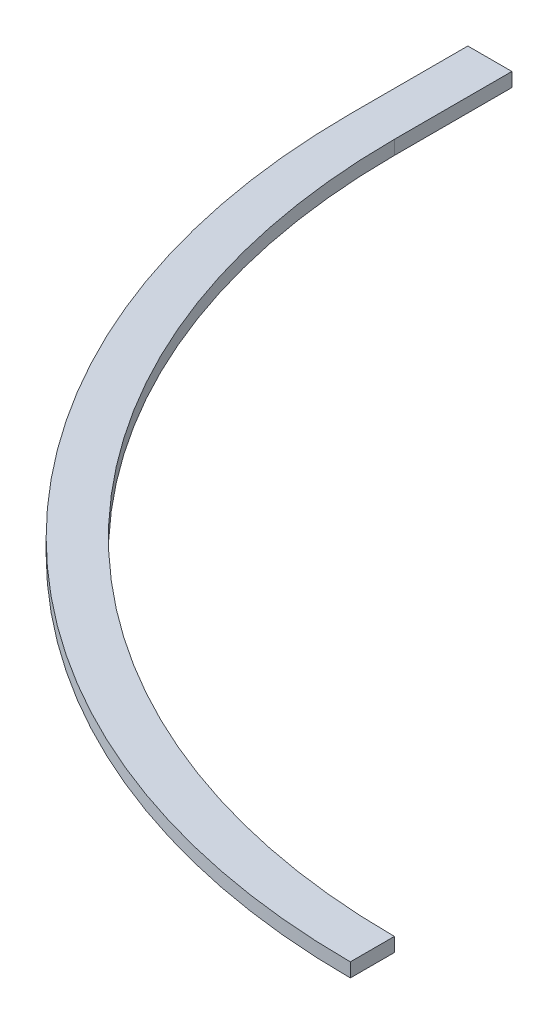
ISO-10303-21;
HEADER;
FILE_DESCRIPTION(('STEP AP214'),'2;1');
FILE_NAME('part.step','',(''),(''),'','','');
FILE_SCHEMA(('AUTOMOTIVE_DESIGN { 1 0 10303 214 1 1 1 1 }'));
ENDSEC;
DATA;
#1=APPLICATION_CONTEXT('core data for automotive mechanical design processes');
#2=APPLICATION_PROTOCOL_DEFINITION('international standard','automotive_design',2000,#1);
#3=PRODUCT_CONTEXT('',#1,'mechanical');
#4=PRODUCT('Part','Part','',(#3));
#5=PRODUCT_RELATED_PRODUCT_CATEGORY('part','',(#4));
#6=PRODUCT_DEFINITION_FORMATION('','',#4);
#7=PRODUCT_DEFINITION_CONTEXT('part definition',#1,'design');
#8=PRODUCT_DEFINITION('design','',#6,#7);
#9=PRODUCT_DEFINITION_SHAPE('','',#8);
#10=(LENGTH_UNIT() NAMED_UNIT(*) SI_UNIT(.MILLI.,.METRE.));
#11=(NAMED_UNIT(*) PLANE_ANGLE_UNIT() SI_UNIT($,.RADIAN.));
#12=(NAMED_UNIT(*) SI_UNIT($,.STERADIAN.) SOLID_ANGLE_UNIT());
#13=UNCERTAINTY_MEASURE_WITH_UNIT(LENGTH_MEASURE(1.E-05),#10,'distance_accuracy_value','');
#14=(GEOMETRIC_REPRESENTATION_CONTEXT(3) GLOBAL_UNCERTAINTY_ASSIGNED_CONTEXT((#13)) GLOBAL_UNIT_ASSIGNED_CONTEXT((#10,
#11,#12)) REPRESENTATION_CONTEXT('',''));
#15=CARTESIAN_POINT('',(0.,0.,0.));
#16=DIRECTION('',(0.,0.,1.));
#17=DIRECTION('',(1.,0.,0.));
#18=AXIS2_PLACEMENT_3D('',#15,#16,#17);
#19=CARTESIAN_POINT('',(0.,9.525,0.));
#20=DIRECTION('',(0.,-1.,0.));
#21=DIRECTION('',(0.,0.,-1.));
#22=AXIS2_PLACEMENT_3D('',#19,#20,#21);
#23=CYLINDRICAL_SURFACE('',#22,470.);
#24=CARTESIAN_POINT('',(0.,0.,0.));
#25=DIRECTION('',(0.,1.,0.));
#26=DIRECTION('',(0.,0.,1.));
#27=AXIS2_PLACEMENT_3D('',#24,#25,#26);
#28=CIRCLE('',#27,470.);
#29=CARTESIAN_POINT('',(-470.,0.,0.));
#30=VERTEX_POINT('',#29);
#31=CARTESIAN_POINT('',(0.,0.,470.));
#32=VERTEX_POINT('',#31);
#33=EDGE_CURVE('E118',#30,#32,#28,.T.);
#34=ORIENTED_EDGE('',*,*,#33,.F.);
#35=DIRECTION('',(0.,-1.,0.));
#36=VECTOR('',#35,1.);
#37=CARTESIAN_POINT('',(-470.,9.525,0.));
#38=LINE('',#37,#36);
#39=CARTESIAN_POINT('',(-470.,9.525,0.));
#40=VERTEX_POINT('',#39);
#41=EDGE_CURVE('E11',#40,#30,#38,.T.);
#42=ORIENTED_EDGE('',*,*,#41,.F.);
#43=CARTESIAN_POINT('',(0.,9.525,0.));
#44=DIRECTION('',(0.,1.,0.));
#45=DIRECTION('',(0.,0.,1.));
#46=AXIS2_PLACEMENT_3D('',#43,#44,#45);
#47=CIRCLE('',#46,470.);
#48=CARTESIAN_POINT('',(0.,9.525,470.));
#49=VERTEX_POINT('',#48);
#50=EDGE_CURVE('E126',#40,#49,#47,.T.);
#51=ORIENTED_EDGE('',*,*,#50,.T.);
#52=DIRECTION('',(0.,-1.,0.));
#53=VECTOR('',#52,1.);
#54=CARTESIAN_POINT('',(0.,9.525,470.));
#55=LINE('',#54,#53);
#56=EDGE_CURVE('E57',#49,#32,#55,.T.);
#57=ORIENTED_EDGE('',*,*,#56,.T.);
#58=EDGE_LOOP('',(#34,#42,#51,#57));
#59=FACE_BOUND('',#58,.T.);
#60=ADVANCED_FACE('F41',(#59),#23,.F.);
#61=CARTESIAN_POINT('',(0.,9.525,0.));
#62=DIRECTION('',(0.,-1.,0.));
#63=DIRECTION('',(0.,0.,-1.));
#64=AXIS2_PLACEMENT_3D('',#61,#62,#63);
#65=CYLINDRICAL_SURFACE('',#64,500.);
#66=CARTESIAN_POINT('',(0.,0.,0.));
#67=DIRECTION('',(0.,1.,0.));
#68=DIRECTION('',(0.,0.,1.));
#69=AXIS2_PLACEMENT_3D('',#66,#67,#68);
#70=CIRCLE('',#69,500.);
#71=CARTESIAN_POINT('',(-500.,0.,0.));
#72=VERTEX_POINT('',#71);
#73=CARTESIAN_POINT('',(0.,0.,500.));
#74=VERTEX_POINT('',#73);
#75=EDGE_CURVE('E120',#72,#74,#70,.T.);
#76=ORIENTED_EDGE('',*,*,#75,.T.);
#77=DIRECTION('',(0.,-1.,0.));
#78=VECTOR('',#77,1.);
#79=CARTESIAN_POINT('',(0.,9.525,500.));
#80=LINE('',#79,#78);
#81=CARTESIAN_POINT('',(0.,9.525,500.));
#82=VERTEX_POINT('',#81);
#83=EDGE_CURVE('E70',#82,#74,#80,.T.);
#84=ORIENTED_EDGE('',*,*,#83,.F.);
#85=CARTESIAN_POINT('',(0.,9.525,0.));
#86=DIRECTION('',(0.,1.,0.));
#87=DIRECTION('',(0.,0.,1.));
#88=AXIS2_PLACEMENT_3D('',#85,#86,#87);
#89=CIRCLE('',#88,500.);
#90=CARTESIAN_POINT('',(-500.,9.525,0.));
#91=VERTEX_POINT('',#90);
#92=EDGE_CURVE('E128',#91,#82,#89,.T.);
#93=ORIENTED_EDGE('',*,*,#92,.F.);
#94=DIRECTION('',(0.,-1.,0.));
#95=VECTOR('',#94,1.);
#96=CARTESIAN_POINT('',(-500.,9.525,0.));
#97=LINE('',#96,#95);
#98=EDGE_CURVE('E49',#91,#72,#97,.T.);
#99=ORIENTED_EDGE('',*,*,#98,.T.);
#100=EDGE_LOOP('',(#76,#84,#93,#99));
#101=FACE_BOUND('',#100,.T.);
#102=ADVANCED_FACE('F139',(#101),#65,.T.);
#103=CARTESIAN_POINT('',(0.,9.525,0.));
#104=DIRECTION('',(1.,0.,0.));
#105=DIRECTION('',(0.,0.,-1.));
#106=AXIS2_PLACEMENT_3D('',#103,#104,#105);
#107=PLANE('',#106);
#108=DIRECTION('',(0.,0.,1.));
#109=VECTOR('',#108,1.);
#110=CARTESIAN_POINT('',(0.,0.,0.));
#111=LINE('',#110,#109);
#112=EDGE_CURVE('E129',#32,#74,#111,.T.);
#113=ORIENTED_EDGE('',*,*,#112,.F.);
#114=ORIENTED_EDGE('',*,*,#56,.F.);
#115=DIRECTION('',(0.,0.,1.));
#116=VECTOR('',#115,1.);
#117=CARTESIAN_POINT('',(0.,9.525,0.));
#118=LINE('',#117,#116);
#119=EDGE_CURVE('E131',#49,#82,#118,.T.);
#120=ORIENTED_EDGE('',*,*,#119,.T.);
#121=ORIENTED_EDGE('',*,*,#83,.T.);
#122=EDGE_LOOP('',(#113,#114,#120,#121));
#123=FACE_BOUND('',#122,.T.);
#124=ADVANCED_FACE('F156',(#123),#107,.T.);
#125=CARTESIAN_POINT('',(0.,9.525,0.));
#126=DIRECTION('',(0.,1.,0.));
#127=DIRECTION('',(0.,0.,1.));
#128=AXIS2_PLACEMENT_3D('',#125,#126,#127);
#129=PLANE('',#128);
#130=ORIENTED_EDGE('',*,*,#50,.F.);
#131=DIRECTION('',(0.,0.,1.));
#132=VECTOR('',#131,1.);
#133=CARTESIAN_POINT('',(-470.,9.525,-79.9999999999999));
#134=LINE('',#133,#132);
#135=CARTESIAN_POINT('',(-470.,9.525,-79.9999999999999));
#136=VERTEX_POINT('',#135);
#137=EDGE_CURVE('E145',#136,#40,#134,.T.);
#138=ORIENTED_EDGE('',*,*,#137,.F.);
#139=DIRECTION('',(1.,0.,0.));
#140=VECTOR('',#139,1.);
#141=CARTESIAN_POINT('',(-500.,9.525,-79.9999999999999));
#142=LINE('',#141,#140);
#143=CARTESIAN_POINT('',(-500.,9.525,-79.9999999999999));
#144=VERTEX_POINT('',#143);
#145=EDGE_CURVE('E112',#144,#136,#142,.T.);
#146=ORIENTED_EDGE('',*,*,#145,.F.);
#147=DIRECTION('',(0.,0.,1.));
#148=VECTOR('',#147,1.);
#149=CARTESIAN_POINT('',(-500.,9.525,-79.9999999999999));
#150=LINE('',#149,#148);
#151=EDGE_CURVE('E122',#144,#91,#150,.T.);
#152=ORIENTED_EDGE('',*,*,#151,.T.);
#153=ORIENTED_EDGE('',*,*,#92,.T.);
#154=ORIENTED_EDGE('',*,*,#119,.F.);
#155=EDGE_LOOP('',(#130,#138,#146,#152,#153,#154));
#156=FACE_BOUND('',#155,.T.);
#157=ADVANCED_FACE('F149',(#156),#129,.T.);
#158=CARTESIAN_POINT('',(0.,0.,0.));
#159=DIRECTION('',(0.,1.,0.));
#160=DIRECTION('',(0.,0.,1.));
#161=AXIS2_PLACEMENT_3D('',#158,#159,#160);
#162=PLANE('',#161);
#163=ORIENTED_EDGE('',*,*,#33,.T.);
#164=ORIENTED_EDGE('',*,*,#112,.T.);
#165=ORIENTED_EDGE('',*,*,#75,.F.);
#166=DIRECTION('',(0.,0.,1.));
#167=VECTOR('',#166,1.);
#168=CARTESIAN_POINT('',(-500.,0.,-79.9999999999999));
#169=LINE('',#168,#167);
#170=CARTESIAN_POINT('',(-500.,0.,-79.9999999999999));
#171=VERTEX_POINT('',#170);
#172=EDGE_CURVE('E103',#171,#72,#169,.T.);
#173=ORIENTED_EDGE('',*,*,#172,.F.);
#174=DIRECTION('',(-1.,0.,0.));
#175=VECTOR('',#174,1.);
#176=CARTESIAN_POINT('',(-470.,0.,-79.9999999999999));
#177=LINE('',#176,#175);
#178=CARTESIAN_POINT('',(-470.,0.,-79.9999999999999));
#179=VERTEX_POINT('',#178);
#180=EDGE_CURVE('E96',#179,#171,#177,.T.);
#181=ORIENTED_EDGE('',*,*,#180,.F.);
#182=DIRECTION('',(0.,0.,1.));
#183=VECTOR('',#182,1.);
#184=CARTESIAN_POINT('',(-470.,0.,-79.9999999999999));
#185=LINE('',#184,#183);
#186=EDGE_CURVE('E100',#179,#30,#185,.T.);
#187=ORIENTED_EDGE('',*,*,#186,.T.);
#188=EDGE_LOOP('',(#163,#164,#165,#173,#181,#187));
#189=FACE_BOUND('',#188,.T.);
#190=ADVANCED_FACE('F98',(#189),#162,.F.);
#191=CARTESIAN_POINT('',(-470.,9.525,-79.9999999999999));
#192=DIRECTION('',(-1.,0.,0.));
#193=DIRECTION('',(0.,0.,1.));
#194=AXIS2_PLACEMENT_3D('',#191,#192,#193);
#195=PLANE('',#194);
#196=ORIENTED_EDGE('',*,*,#41,.T.);
#197=ORIENTED_EDGE('',*,*,#186,.F.);
#198=DIRECTION('',(0.,-1.,0.));
#199=VECTOR('',#198,1.);
#200=CARTESIAN_POINT('',(-470.,9.525,-79.9999999999999));
#201=LINE('',#200,#199);
#202=EDGE_CURVE('E107',#136,#179,#201,.T.);
#203=ORIENTED_EDGE('',*,*,#202,.F.);
#204=ORIENTED_EDGE('',*,*,#137,.T.);
#205=EDGE_LOOP('',(#196,#197,#203,#204));
#206=FACE_BOUND('',#205,.T.);
#207=ADVANCED_FACE('F117',(#206),#195,.F.);
#208=CARTESIAN_POINT('',(-500.,0.,-79.9999999999999));
#209=DIRECTION('',(1.,0.,0.));
#210=DIRECTION('',(0.,0.,-1.));
#211=AXIS2_PLACEMENT_3D('',#208,#209,#210);
#212=PLANE('',#211);
#213=ORIENTED_EDGE('',*,*,#98,.F.);
#214=ORIENTED_EDGE('',*,*,#151,.F.);
#215=DIRECTION('',(0.,1.,0.));
#216=VECTOR('',#215,1.);
#217=CARTESIAN_POINT('',(-500.,0.,-79.9999999999999));
#218=LINE('',#217,#216);
#219=EDGE_CURVE('E106',#171,#144,#218,.T.);
#220=ORIENTED_EDGE('',*,*,#219,.F.);
#221=ORIENTED_EDGE('',*,*,#172,.T.);
#222=EDGE_LOOP('',(#213,#214,#220,#221));
#223=FACE_BOUND('',#222,.T.);
#224=ADVANCED_FACE('F143',(#223),#212,.F.);
#225=CARTESIAN_POINT('',(0.,0.,-80.));
#226=DIRECTION('',(0.,0.,-1.));
#227=DIRECTION('',(-1.,0.,0.));
#228=AXIS2_PLACEMENT_3D('',#225,#226,#227);
#229=PLANE('',#228);
#230=ORIENTED_EDGE('',*,*,#202,.T.);
#231=ORIENTED_EDGE('',*,*,#180,.T.);
#232=ORIENTED_EDGE('',*,*,#219,.T.);
#233=ORIENTED_EDGE('',*,*,#145,.T.);
#234=EDGE_LOOP('',(#230,#231,#232,#233));
#235=FACE_BOUND('',#234,.T.);
#236=ADVANCED_FACE('F110',(#235),#229,.T.);
#237=CLOSED_SHELL('',(#60,#102,#124,#157,#190,#207,#224,#236));
#238=MANIFOLD_SOLID_BREP('B2',#237);
#239=ADVANCED_BREP_SHAPE_REPRESENTATION('',(#18,#238),#14);
#240=SHAPE_DEFINITION_REPRESENTATION(#9,#239);
ENDSEC;
END-ISO-10303-21;
